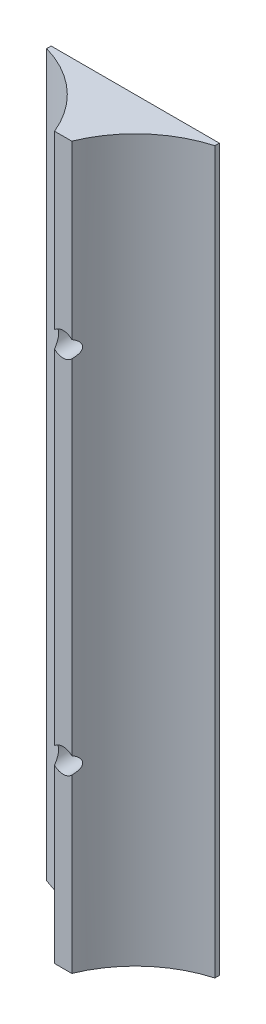
ISO-10303-21;
HEADER;
FILE_DESCRIPTION(('STEP AP214'),'2;1');
FILE_NAME('part.step','',(''),(''),'','','');
FILE_SCHEMA(('AUTOMOTIVE_DESIGN { 1 0 10303 214 1 1 1 1 }'));
ENDSEC;
DATA;
#1=APPLICATION_CONTEXT('core data for automotive mechanical design processes');
#2=APPLICATION_PROTOCOL_DEFINITION('international standard','automotive_design',2000,#1);
#3=PRODUCT_CONTEXT('',#1,'mechanical');
#4=PRODUCT('Part','Part','',(#3));
#5=PRODUCT_RELATED_PRODUCT_CATEGORY('part','',(#4));
#6=PRODUCT_DEFINITION_FORMATION('','',#4);
#7=PRODUCT_DEFINITION_CONTEXT('part definition',#1,'design');
#8=PRODUCT_DEFINITION('design','',#6,#7);
#9=PRODUCT_DEFINITION_SHAPE('','',#8);
#10=(LENGTH_UNIT() NAMED_UNIT(*) SI_UNIT(.MILLI.,.METRE.));
#11=(NAMED_UNIT(*) PLANE_ANGLE_UNIT() SI_UNIT($,.RADIAN.));
#12=(NAMED_UNIT(*) SI_UNIT($,.STERADIAN.) SOLID_ANGLE_UNIT());
#13=UNCERTAINTY_MEASURE_WITH_UNIT(LENGTH_MEASURE(1.E-05),#10,'distance_accuracy_value','');
#14=(GEOMETRIC_REPRESENTATION_CONTEXT(3) GLOBAL_UNCERTAINTY_ASSIGNED_CONTEXT((#13)) GLOBAL_UNIT_ASSIGNED_CONTEXT((#10,
#11,#12)) REPRESENTATION_CONTEXT('',''));
#15=CARTESIAN_POINT('',(0.,0.,0.));
#16=DIRECTION('',(0.,0.,1.));
#17=DIRECTION('',(1.,0.,0.));
#18=AXIS2_PLACEMENT_3D('',#15,#16,#17);
#19=CARTESIAN_POINT('',(-0.716915426349083,60.,0.));
#20=DIRECTION('',(0.,0.,-1.));
#21=DIRECTION('',(-1.,0.,0.));
#22=AXIS2_PLACEMENT_3D('',#19,#20,#21);
#23=PLANE('',#22);
#24=DIRECTION('',(0.,-1.,0.));
#25=VECTOR('',#24,1.);
#26=CARTESIAN_POINT('',(-0.716915426349083,60.,0.));
#27=LINE('',#26,#25);
#28=CARTESIAN_POINT('',(-0.716915426349083,60.,0.));
#29=VERTEX_POINT('',#28);
#30=CARTESIAN_POINT('',(-0.716915426349083,45.6971601476438,0.));
#31=VERTEX_POINT('',#30);
#32=EDGE_CURVE('E141',#29,#31,#27,.T.);
#33=ORIENTED_EDGE('',*,*,#32,.T.);
#34=CARTESIAN_POINT('',(0.,45.,0.));
#35=DIRECTION('',(0.,0.,-1.));
#36=DIRECTION('',(-1.,0.,0.));
#37=AXIS2_PLACEMENT_3D('',#34,#35,#36);
#38=CIRCLE('',#37,0.999999999999999);
#39=CARTESIAN_POINT('',(0.71691542634908,45.6971601476438,0.));
#40=VERTEX_POINT('',#39);
#41=EDGE_CURVE('E66',#31,#40,#38,.T.);
#42=ORIENTED_EDGE('',*,*,#41,.T.);
#43=DIRECTION('',(0.,-1.,0.));
#44=VECTOR('',#43,1.);
#45=CARTESIAN_POINT('',(0.71691542634908,60.,0.));
#46=LINE('',#45,#44);
#47=CARTESIAN_POINT('',(0.71691542634908,60.,0.));
#48=VERTEX_POINT('',#47);
#49=EDGE_CURVE('E146',#48,#40,#46,.T.);
#50=ORIENTED_EDGE('',*,*,#49,.F.);
#51=DIRECTION('',(1.,0.,0.));
#52=VECTOR('',#51,1.);
#53=CARTESIAN_POINT('',(-0.716915426349083,60.,0.));
#54=LINE('',#53,#52);
#55=EDGE_CURVE('E226',#29,#48,#54,.T.);
#56=ORIENTED_EDGE('',*,*,#55,.F.);
#57=EDGE_LOOP('',(#33,#42,#50,#56));
#58=FACE_BOUND('',#57,.T.);
#59=ADVANCED_FACE('F44',(#58),#23,.F.);
#60=CARTESIAN_POINT('',(0.71691542634908,44.3028398523562,0.));
#61=VERTEX_POINT('',#60);
#62=CARTESIAN_POINT('',(0.71691542634908,15.6971601476438,0.));
#63=VERTEX_POINT('',#62);
#64=EDGE_CURVE('E135',#61,#63,#46,.T.);
#65=ORIENTED_EDGE('',*,*,#64,.F.);
#66=CARTESIAN_POINT('',(-0.716915426349081,44.3028398523562,0.));
#67=VERTEX_POINT('',#66);
#68=EDGE_CURVE('E128',#61,#67,#38,.T.);
#69=ORIENTED_EDGE('',*,*,#68,.T.);
#70=CARTESIAN_POINT('',(-0.716915426349083,15.6971601476438,0.));
#71=VERTEX_POINT('',#70);
#72=EDGE_CURVE('E73',#67,#71,#27,.T.);
#73=ORIENTED_EDGE('',*,*,#72,.T.);
#74=CARTESIAN_POINT('',(0.,15.,0.));
#75=DIRECTION('',(0.,0.,-1.));
#76=DIRECTION('',(-1.,0.,0.));
#77=AXIS2_PLACEMENT_3D('',#74,#75,#76);
#78=CIRCLE('',#77,0.999999999999999);
#79=EDGE_CURVE('E176',#71,#63,#78,.T.);
#80=ORIENTED_EDGE('',*,*,#79,.T.);
#81=EDGE_LOOP('',(#65,#69,#73,#80));
#82=FACE_BOUND('',#81,.T.);
#83=ADVANCED_FACE('F134',(#82),#23,.F.);
#84=CARTESIAN_POINT('',(-9.65,60.,3.65));
#85=DIRECTION('',(0.,-1.,0.));
#86=DIRECTION('',(0.,0.,-1.));
#87=AXIS2_PLACEMENT_3D('',#84,#85,#86);
#88=CYLINDRICAL_SURFACE('',#87,9.65);
#89=ORIENTED_EDGE('',*,*,#72,.F.);
#90=CARTESIAN_POINT('',(-0.716915426349081,44.3028398523562,0.));
#91=CARTESIAN_POINT('',(-0.731626591559953,44.317993066255,-0.0360125500297371));
#92=CARTESIAN_POINT('',(-0.746427289121782,44.3341497378012,-0.071606126745061));
#93=CARTESIAN_POINT('',(-0.776091596441795,44.3689553691987,-0.141792911078142));
#94=CARTESIAN_POINT('',(-0.790955115741165,44.3876172826375,-0.176379698883334));
#95=CARTESIAN_POINT('',(-0.820713268380293,44.4281001795659,-0.244560990086599));
#96=CARTESIAN_POINT('',(-0.835604256269462,44.4499688224498,-0.278129185257088));
#97=CARTESIAN_POINT('',(-0.864791011542178,44.4971038626147,-0.342976375015039));
#98=CARTESIAN_POINT('',(-0.879088127702686,44.5223619390459,-0.374260694794433));
#99=CARTESIAN_POINT('',(-0.90373060494839,44.5712174063406,-0.427492562947483));
#100=CARTESIAN_POINT('',(-0.914278910308853,44.5940653716595,-0.450027808037208));
#101=CARTESIAN_POINT('',(-0.934289550986945,44.6425247464023,-0.492395212917311));
#102=CARTESIAN_POINT('',(-0.943754081543092,44.6681303582159,-0.51223285270145));
#103=CARTESIAN_POINT('',(-0.961202858489315,44.722657704727,-0.548537268026509));
#104=CARTESIAN_POINT('',(-0.969166528173057,44.7516178115844,-0.564957469776029));
#105=CARTESIAN_POINT('',(-0.982730330026047,44.8123790990689,-0.592779662883932));
#106=CARTESIAN_POINT('',(-0.988335631475443,44.8441738789142,-0.604192631912942));
#107=CARTESIAN_POINT('',(-0.995439162156062,44.9014519366418,-0.618620867500795));
#108=CARTESIAN_POINT('',(-0.997617314998399,44.9264997580079,-0.62302944421574));
#109=CARTESIAN_POINT('',(-1.00005656533799,44.9770685583627,-0.627965285179228));
#110=CARTESIAN_POINT('',(-1.00031864577151,45.002589288014,-0.628494539502527));
#111=CARTESIAN_POINT('',(-0.998899314656266,45.0533351820465,-0.625623814816787));
#112=CARTESIAN_POINT('',(-0.997218870568463,45.0785604872436,-0.62222579176134));
#113=CARTESIAN_POINT('',(-0.99207978464136,45.1280571859245,-0.611801332437795));
#114=CARTESIAN_POINT('',(-0.988619911431289,45.1523279062961,-0.604772383542305));
#115=CARTESIAN_POINT('',(-0.978845684035985,45.2070301995629,-0.584824756764977));
#116=CARTESIAN_POINT('',(-0.971971206592135,45.236933391623,-0.570738998278085));
#117=CARTESIAN_POINT('',(-0.956316603020585,45.2938265752719,-0.53839981571781));
#118=CARTESIAN_POINT('',(-0.947532962027114,45.3208110542777,-0.520138701339642));
#119=CARTESIAN_POINT('',(-0.923337388047236,45.3863558037991,-0.469347644673791));
#120=CARTESIAN_POINT('',(-0.906987313931184,45.4228257363458,-0.434590792193247));
#121=CARTESIAN_POINT('',(-0.872660120566985,45.4897831897159,-0.360299334114968));
#122=CARTESIAN_POINT('',(-0.854675165013883,45.5202394098099,-0.320741376128269));
#123=CARTESIAN_POINT('',(-0.816654175974628,45.5782433109871,-0.235465213914605));
#124=CARTESIAN_POINT('',(-0.796565677787949,45.605399230859,-0.18950743874143));
#125=CARTESIAN_POINT('',(-0.766499034599836,45.6424370315779,-0.119158167411911));
#126=CARTESIAN_POINT('',(-0.756560208295124,45.6540949082111,-0.0956497242915917));
#127=CARTESIAN_POINT('',(-0.736709217165992,45.67637359029,-0.0481628907346409));
#128=CARTESIAN_POINT('',(-0.72679703667349,45.6869952886531,-0.0241849266891303));
#129=CARTESIAN_POINT('',(-0.716915426349082,45.6971601476438,0.));
#130=B_SPLINE_CURVE_WITH_KNOTS('',3,(#90,#91,#92,#93,#94,#95,#96,#97,#98,#99,#100,#101,#102,
#103,#104,#105,#106,#107,#108,#109,#110,#111,#112,#113,#114,#115,#116,#117,#118,#119,#120,#121,
#122,#123,#124,#125,#126,#127,#128,#129),.UNSPECIFIED.,.F.,.F.,(4,2,2,2,2,2,2,2,2,2,2,2,2,2,2,2,
2,2,2,4),(0.,0.125283365511654,0.251241443009631,0.379308364144583,0.507066452204209,
0.608220800752168,0.70916648965566,0.811408876611758,0.913425977204674,0.989662890338827,
1.06586069154408,1.14202055930405,1.21823320099602,1.31895158469356,1.41985699077545,
1.57786206854548,1.73666903909468,1.90743541851957,1.99159762809235,2.07568665881576),.UNSPECIFIED.);
#131=EDGE_CURVE('E11',#67,#31,#130,.T.);
#132=ORIENTED_EDGE('',*,*,#131,.T.);
#133=ORIENTED_EDGE('',*,*,#32,.F.);
#134=CARTESIAN_POINT('',(-9.65,60.,3.65));
#135=DIRECTION('',(0.,-1.,0.));
#136=DIRECTION('',(0.,0.,-1.));
#137=AXIS2_PLACEMENT_3D('',#134,#135,#136);
#138=CIRCLE('',#137,9.65);
#139=CARTESIAN_POINT('',(-7.,60.,-5.62900856772964));
#140=VERTEX_POINT('',#139);
#141=EDGE_CURVE('E231',#140,#29,#138,.T.);
#142=ORIENTED_EDGE('',*,*,#141,.F.);
#143=DIRECTION('',(0.,-1.,0.));
#144=VECTOR('',#143,1.);
#145=CARTESIAN_POINT('',(-7.,60.,-5.62900856772964));
#146=LINE('',#145,#144);
#147=CARTESIAN_POINT('',(-7.,0.,-5.62900856772964));
#148=VERTEX_POINT('',#147);
#149=EDGE_CURVE('E234',#140,#148,#146,.T.);
#150=ORIENTED_EDGE('',*,*,#149,.T.);
#151=CARTESIAN_POINT('',(-9.65,0.,3.65));
#152=DIRECTION('',(0.,-1.,0.));
#153=DIRECTION('',(0.,0.,-1.));
#154=AXIS2_PLACEMENT_3D('',#151,#152,#153);
#155=CIRCLE('',#154,9.65);
#156=CARTESIAN_POINT('',(-0.716915426349083,0.,0.));
#157=VERTEX_POINT('',#156);
#158=EDGE_CURVE('E260',#148,#157,#155,.T.);
#159=ORIENTED_EDGE('',*,*,#158,.T.);
#160=CARTESIAN_POINT('',(-0.716915426349081,14.3028398523562,0.));
#161=VERTEX_POINT('',#160);
#162=EDGE_CURVE('E142',#161,#157,#27,.T.);
#163=ORIENTED_EDGE('',*,*,#162,.F.);
#164=CARTESIAN_POINT('',(-0.716915426349081,14.3028398523562,0.));
#165=CARTESIAN_POINT('',(-0.731626591559953,14.317993066255,-0.0360125500297339));
#166=CARTESIAN_POINT('',(-0.746427289121782,14.3341497378012,-0.0716061267450571));
#167=CARTESIAN_POINT('',(-0.776091596441795,14.3689553691987,-0.14179291107814));
#168=CARTESIAN_POINT('',(-0.790955115741165,14.3876172826375,-0.176379698883334));
#169=CARTESIAN_POINT('',(-0.820713268380293,14.4281001795659,-0.244560990086598));
#170=CARTESIAN_POINT('',(-0.835604256269462,14.4499688224498,-0.278129185257086));
#171=CARTESIAN_POINT('',(-0.864791011542177,14.4971038626148,-0.342976375015037));
#172=CARTESIAN_POINT('',(-0.879088127702684,14.5223619390459,-0.374260694794434));
#173=CARTESIAN_POINT('',(-0.903730604948388,14.5712174063406,-0.427492562947484));
#174=CARTESIAN_POINT('',(-0.914278910308852,14.5940653716595,-0.450027808037209));
#175=CARTESIAN_POINT('',(-0.934289550986945,14.6425247464023,-0.49239521291731));
#176=CARTESIAN_POINT('',(-0.943754081543092,14.668130358216,-0.512232852701449));
#177=CARTESIAN_POINT('',(-0.961202858489316,14.722657704727,-0.54853726802651));
#178=CARTESIAN_POINT('',(-0.969166528173057,14.7516178115844,-0.564957469776031));
#179=CARTESIAN_POINT('',(-0.982730330026048,14.8123790990689,-0.592779662883937));
#180=CARTESIAN_POINT('',(-0.988335631475444,14.8441738789142,-0.604192631912949));
#181=CARTESIAN_POINT('',(-0.995439162156063,14.9014519366418,-0.618620867500799));
#182=CARTESIAN_POINT('',(-0.997617314998399,14.9264997580079,-0.62302944421574));
#183=CARTESIAN_POINT('',(-1.00005656533799,14.9770685583627,-0.627965285179226));
#184=CARTESIAN_POINT('',(-1.00031864577151,15.002589288014,-0.628494539502527));
#185=CARTESIAN_POINT('',(-0.998899314656266,15.0533351820465,-0.625623814816786));
#186=CARTESIAN_POINT('',(-0.997218870568463,15.0785604872436,-0.622225791761335));
#187=CARTESIAN_POINT('',(-0.992079784641359,15.1280571859245,-0.611801332437789));
#188=CARTESIAN_POINT('',(-0.988619911431288,15.1523279062961,-0.604772383542302));
#189=CARTESIAN_POINT('',(-0.978845684035985,15.2070301995629,-0.584824756764976));
#190=CARTESIAN_POINT('',(-0.971971206592135,15.236933391623,-0.570738998278082));
#191=CARTESIAN_POINT('',(-0.956316603020585,15.2938265752719,-0.538399815717806));
#192=CARTESIAN_POINT('',(-0.947532962027114,15.3208110542777,-0.520138701339639));
#193=CARTESIAN_POINT('',(-0.923337388047234,15.3863558037991,-0.469347644673789));
#194=CARTESIAN_POINT('',(-0.906987313931182,15.4228257363458,-0.434590792193243));
#195=CARTESIAN_POINT('',(-0.872660120566983,15.4897831897159,-0.360299334114964));
#196=CARTESIAN_POINT('',(-0.854675165013881,15.5202394098099,-0.320741376128264));
#197=CARTESIAN_POINT('',(-0.816654175974626,15.5782433109871,-0.2354652139146));
#198=CARTESIAN_POINT('',(-0.796565677787948,15.605399230859,-0.189507438741425));
#199=CARTESIAN_POINT('',(-0.766499034599834,15.6424370315779,-0.119158167411908));
#200=CARTESIAN_POINT('',(-0.756560208295121,15.6540949082111,-0.0956497242915889));
#201=CARTESIAN_POINT('',(-0.736709217165989,15.67637359029,-0.0481628907346395));
#202=CARTESIAN_POINT('',(-0.726797036673487,15.6869952886531,-0.0241849266891301));
#203=CARTESIAN_POINT('',(-0.716915426349082,15.6971601476438,0.));
#204=B_SPLINE_CURVE_WITH_KNOTS('',3,(#164,#165,#166,#167,#168,#169,#170,#171,#172,#173,#174,
#175,#176,#177,#178,#179,#180,#181,#182,#183,#184,#185,#186,#187,#188,#189,#190,#191,#192,#193,
#194,#195,#196,#197,#198,#199,#200,#201,#202,#203),.UNSPECIFIED.,.F.,.F.,(4,2,2,2,2,2,2,2,2,2,2,
2,2,2,2,2,2,2,2,4),(0.,0.125283365511651,0.251241443009631,0.379308364144585,0.507066452204207,
0.608220800752166,0.709166489655664,0.811408876611768,0.913425977204679,0.989662890338838,
1.06586069154409,1.14202055930407,1.21823320099603,1.31895158469356,1.41985699077545,
1.57786206854549,1.73666903909469,1.90743541851957,1.99159762809236,2.07568665881576),.UNSPECIFIED.);
#205=EDGE_CURVE('E59',#161,#71,#204,.T.);
#206=ORIENTED_EDGE('',*,*,#205,.T.);
#207=EDGE_LOOP('',(#89,#132,#133,#142,#150,#159,#163,#206));
#208=FACE_BOUND('',#207,.T.);
#209=ADVANCED_FACE('F46',(#208),#88,.F.);
#210=CARTESIAN_POINT('',(0.71691542634908,14.3028398523562,0.));
#211=VERTEX_POINT('',#210);
#212=CARTESIAN_POINT('',(0.71691542634908,0.,0.));
#213=VERTEX_POINT('',#212);
#214=EDGE_CURVE('E209',#211,#213,#46,.T.);
#215=ORIENTED_EDGE('',*,*,#214,.F.);
#216=EDGE_CURVE('E177',#211,#161,#78,.T.);
#217=ORIENTED_EDGE('',*,*,#216,.T.);
#218=ORIENTED_EDGE('',*,*,#162,.T.);
#219=DIRECTION('',(1.,0.,0.));
#220=VECTOR('',#219,1.);
#221=CARTESIAN_POINT('',(-0.716915426349083,0.,0.));
#222=LINE('',#221,#220);
#223=EDGE_CURVE('E212',#157,#213,#222,.T.);
#224=ORIENTED_EDGE('',*,*,#223,.T.);
#225=EDGE_LOOP('',(#215,#217,#218,#224));
#226=FACE_BOUND('',#225,.T.);
#227=ADVANCED_FACE('F185',(#226),#23,.F.);
#228=CARTESIAN_POINT('',(9.65,60.,3.65));
#229=DIRECTION('',(0.,-1.,0.));
#230=DIRECTION('',(0.,0.,-1.));
#231=AXIS2_PLACEMENT_3D('',#228,#229,#230);
#232=CYLINDRICAL_SURFACE('',#231,9.65);
#233=ORIENTED_EDGE('',*,*,#49,.T.);
#234=CARTESIAN_POINT('',(0.71691542634908,45.6971601476438,0.));
#235=CARTESIAN_POINT('',(0.731626591559951,45.682006933745,-0.0360125500297358));
#236=CARTESIAN_POINT('',(0.746427289121779,45.6658502621988,-0.0716061267450583));
#237=CARTESIAN_POINT('',(0.776091596441791,45.6310446308013,-0.141792911078141));
#238=CARTESIAN_POINT('',(0.790955115741161,45.6123827173625,-0.176379698883335));
#239=CARTESIAN_POINT('',(0.820713268380289,45.5718998204341,-0.2445609900866));
#240=CARTESIAN_POINT('',(0.835604256269459,45.5500311775502,-0.278129185257087));
#241=CARTESIAN_POINT('',(0.864791011542176,45.5028961373852,-0.342976375015039));
#242=CARTESIAN_POINT('',(0.879088127702683,45.4776380609541,-0.374260694794436));
#243=CARTESIAN_POINT('',(0.903730604948387,45.4287825936594,-0.42749256294749));
#244=CARTESIAN_POINT('',(0.914278910308851,45.4059346283405,-0.450027808037217));
#245=CARTESIAN_POINT('',(0.934289550986944,45.3574752535977,-0.49239521291732));
#246=CARTESIAN_POINT('',(0.943754081543091,45.331869641784,-0.512232852701457));
#247=CARTESIAN_POINT('',(0.961202858489315,45.277342295273,-0.548537268026518));
#248=CARTESIAN_POINT('',(0.969166528173058,45.2483821884156,-0.56495746977604));
#249=CARTESIAN_POINT('',(0.982730330026048,45.1876209009311,-0.592779662883942));
#250=CARTESIAN_POINT('',(0.988335631475443,45.1558261210858,-0.604192631912951));
#251=CARTESIAN_POINT('',(0.995439162156062,45.0985480633582,-0.6186208675008));
#252=CARTESIAN_POINT('',(0.997617314998399,45.0735002419921,-0.623029444215743));
#253=CARTESIAN_POINT('',(1.00005656533799,45.0229314416373,-0.627965285179234));
#254=CARTESIAN_POINT('',(1.00031864577151,44.997410711986,-0.628494539502538));
#255=CARTESIAN_POINT('',(0.998899314656266,44.9466648179535,-0.625623814816797));
#256=CARTESIAN_POINT('',(0.997218870568463,44.9214395127564,-0.622225791761342));
#257=CARTESIAN_POINT('',(0.992079784641359,44.8719428140755,-0.611801332437794));
#258=CARTESIAN_POINT('',(0.988619911431287,44.8476720937039,-0.60477238354231));
#259=CARTESIAN_POINT('',(0.978845684035984,44.7929698004371,-0.584824756764986));
#260=CARTESIAN_POINT('',(0.971971206592134,44.763066608377,-0.570738998278089));
#261=CARTESIAN_POINT('',(0.956316603020585,44.7061734247281,-0.538399815717811));
#262=CARTESIAN_POINT('',(0.947532962027114,44.6791889457223,-0.520138701339646));
#263=CARTESIAN_POINT('',(0.923337388047236,44.6136441962009,-0.469347644673799));
#264=CARTESIAN_POINT('',(0.906987313931183,44.5771742636542,-0.434590792193255));
#265=CARTESIAN_POINT('',(0.872660120566985,44.5102168102841,-0.360299334114978));
#266=CARTESIAN_POINT('',(0.854675165013884,44.4797605901901,-0.320741376128279));
#267=CARTESIAN_POINT('',(0.816654175974629,44.4217566890129,-0.235465213914613));
#268=CARTESIAN_POINT('',(0.79656567778795,44.394600769141,-0.189507438741436));
#269=CARTESIAN_POINT('',(0.766499034599835,44.3575629684221,-0.119158167411913));
#270=CARTESIAN_POINT('',(0.756560208295122,44.3459050917889,-0.0956497242915926));
#271=CARTESIAN_POINT('',(0.736709217165989,44.32362640971,-0.0481628907346419));
#272=CARTESIAN_POINT('',(0.726797036673487,44.3130047113469,-0.0241849266891331));
#273=CARTESIAN_POINT('',(0.716915426349079,44.3028398523562,0.));
#274=B_SPLINE_CURVE_WITH_KNOTS('',3,(#234,#235,#236,#237,#238,#239,#240,#241,#242,#243,#244,
#245,#246,#247,#248,#249,#250,#251,#252,#253,#254,#255,#256,#257,#258,#259,#260,#261,#262,#263,
#264,#265,#266,#267,#268,#269,#270,#271,#272,#273),.UNSPECIFIED.,.F.,.F.,(4,2,2,2,2,2,2,2,2,2,2,
2,2,2,2,2,2,2,2,4),(0.,0.125283365511647,0.251241443009628,0.379308364144585,0.507066452204209,
0.608220800752171,0.709166489655667,0.811408876611781,0.913425977204681,0.989662890338834,
1.06586069154409,1.14202055930408,1.21823320099603,1.31895158469358,1.41985699077546,
1.57786206854548,1.73666903909469,1.90743541851958,1.99159762809237,2.07568665881577),.UNSPECIFIED.);
#275=EDGE_CURVE('E190',#40,#61,#274,.T.);
#276=ORIENTED_EDGE('',*,*,#275,.T.);
#277=ORIENTED_EDGE('',*,*,#64,.T.);
#278=CARTESIAN_POINT('',(0.71691542634908,15.6971601476438,0.));
#279=CARTESIAN_POINT('',(0.731626591559952,15.682006933745,-0.0360125500297375));
#280=CARTESIAN_POINT('',(0.746427289121781,15.6658502621988,-0.0716061267450605));
#281=CARTESIAN_POINT('',(0.776091596441794,15.6310446308013,-0.141792911078142));
#282=CARTESIAN_POINT('',(0.790955115741164,15.6123827173625,-0.176379698883335));
#283=CARTESIAN_POINT('',(0.820713268380291,15.5718998204341,-0.244560990086601));
#284=CARTESIAN_POINT('',(0.835604256269461,15.5500311775502,-0.278129185257089));
#285=CARTESIAN_POINT('',(0.864791011542177,15.5028961373853,-0.34297637501504));
#286=CARTESIAN_POINT('',(0.879088127702685,15.4776380609541,-0.374260694794435));
#287=CARTESIAN_POINT('',(0.903730604948388,15.4287825936594,-0.427492562947488));
#288=CARTESIAN_POINT('',(0.914278910308851,15.4059346283405,-0.450027808037215));
#289=CARTESIAN_POINT('',(0.934289550986944,15.3574752535977,-0.492395212917318));
#290=CARTESIAN_POINT('',(0.943754081543092,15.331869641784,-0.512232852701455));
#291=CARTESIAN_POINT('',(0.961202858489316,15.277342295273,-0.548537268026515));
#292=CARTESIAN_POINT('',(0.969166528173057,15.2483821884156,-0.564957469776037));
#293=CARTESIAN_POINT('',(0.982730330026048,15.1876209009311,-0.592779662883944));
#294=CARTESIAN_POINT('',(0.988335631475444,15.1558261210858,-0.604192631912957));
#295=CARTESIAN_POINT('',(0.995439162156063,15.0985480633582,-0.618620867500805));
#296=CARTESIAN_POINT('',(0.997617314998399,15.0735002419921,-0.623029444215744));
#297=CARTESIAN_POINT('',(1.00005656533799,15.0229314416373,-0.627965285179232));
#298=CARTESIAN_POINT('',(1.00031864577151,14.997410711986,-0.628494539502537));
#299=CARTESIAN_POINT('',(0.998899314656266,14.9466648179535,-0.625623814816798));
#300=CARTESIAN_POINT('',(0.997218870568462,14.9214395127564,-0.622225791761344));
#301=CARTESIAN_POINT('',(0.992079784641358,14.8719428140755,-0.611801332437794));
#302=CARTESIAN_POINT('',(0.988619911431287,14.8476720937039,-0.604772383542306));
#303=CARTESIAN_POINT('',(0.978845684035983,14.7929698004371,-0.58482475676498));
#304=CARTESIAN_POINT('',(0.971971206592132,14.763066608377,-0.570738998278087));
#305=CARTESIAN_POINT('',(0.956316603020581,14.7061734247281,-0.53839981571781));
#306=CARTESIAN_POINT('',(0.94753296202711,14.6791889457223,-0.520138701339642));
#307=CARTESIAN_POINT('',(0.92333738804723,14.6136441962009,-0.46934764467379));
#308=CARTESIAN_POINT('',(0.906987313931177,14.5771742636541,-0.434590792193244));
#309=CARTESIAN_POINT('',(0.872660120566978,14.5102168102841,-0.360299334114962));
#310=CARTESIAN_POINT('',(0.854675165013875,14.4797605901901,-0.320741376128259));
#311=CARTESIAN_POINT('',(0.816654175974621,14.4217566890128,-0.235465213914593));
#312=CARTESIAN_POINT('',(0.796565677787944,14.394600769141,-0.189507438741419));
#313=CARTESIAN_POINT('',(0.766499034599831,14.3575629684221,-0.119158167411904));
#314=CARTESIAN_POINT('',(0.756560208295118,14.3459050917889,-0.0956497242915866));
#315=CARTESIAN_POINT('',(0.736709217165987,14.3236264097099,-0.04816289073464));
#316=CARTESIAN_POINT('',(0.726797036673486,14.3130047113469,-0.0241849266891321));
#317=CARTESIAN_POINT('',(0.71691542634908,14.3028398523562,0.));
#318=B_SPLINE_CURVE_WITH_KNOTS('',3,(#278,#279,#280,#281,#282,#283,#284,#285,#286,#287,#288,
#289,#290,#291,#292,#293,#294,#295,#296,#297,#298,#299,#300,#301,#302,#303,#304,#305,#306,#307,
#308,#309,#310,#311,#312,#313,#314,#315,#316,#317),.UNSPECIFIED.,.F.,.F.,(4,2,2,2,2,2,2,2,2,2,2,
2,2,2,2,2,2,2,2,4),(0.,0.12528336551165,0.251241443009629,0.379308364144584,0.507066452204208,
0.608220800752169,0.709166489655667,0.811408876611771,0.913425977204682,0.989662890338843,
1.06586069154409,1.14202055930407,1.21823320099604,1.31895158469358,1.41985699077547,
1.5778620685455,1.73666903909471,1.90743541851959,1.99159762809238,2.07568665881577),.UNSPECIFIED.);
#319=EDGE_CURVE('E165',#63,#211,#318,.T.);
#320=ORIENTED_EDGE('',*,*,#319,.T.);
#321=ORIENTED_EDGE('',*,*,#214,.T.);
#322=CARTESIAN_POINT('',(9.65,0.,3.65));
#323=DIRECTION('',(0.,-1.,0.));
#324=DIRECTION('',(0.,0.,-1.));
#325=AXIS2_PLACEMENT_3D('',#322,#323,#324);
#326=CIRCLE('',#325,9.65);
#327=CARTESIAN_POINT('',(7.,0.,-5.62900856772964));
#328=VERTEX_POINT('',#327);
#329=EDGE_CURVE('E265',#213,#328,#326,.T.);
#330=ORIENTED_EDGE('',*,*,#329,.T.);
#331=DIRECTION('',(0.,-1.,0.));
#332=VECTOR('',#331,1.);
#333=CARTESIAN_POINT('',(7.,60.,-5.62900856772964));
#334=LINE('',#333,#332);
#335=CARTESIAN_POINT('',(7.,60.,-5.62900856772964));
#336=VERTEX_POINT('',#335);
#337=EDGE_CURVE('E215',#336,#328,#334,.T.);
#338=ORIENTED_EDGE('',*,*,#337,.F.);
#339=CARTESIAN_POINT('',(9.65,60.,3.65));
#340=DIRECTION('',(0.,-1.,0.));
#341=DIRECTION('',(0.,0.,-1.));
#342=AXIS2_PLACEMENT_3D('',#339,#340,#341);
#343=CIRCLE('',#342,9.65);
#344=EDGE_CURVE('E224',#48,#336,#343,.T.);
#345=ORIENTED_EDGE('',*,*,#344,.F.);
#346=EDGE_LOOP('',(#233,#276,#277,#320,#321,#330,#338,#345));
#347=FACE_BOUND('',#346,.T.);
#348=ADVANCED_FACE('F180',(#347),#232,.F.);
#349=CARTESIAN_POINT('',(7.,60.,-5.62900856772964));
#350=DIRECTION('',(-1.,0.,0.));
#351=DIRECTION('',(0.,0.,1.));
#352=AXIS2_PLACEMENT_3D('',#349,#350,#351);
#353=PLANE('',#352);
#354=DIRECTION('',(0.,0.,-1.));
#355=VECTOR('',#354,1.);
#356=CARTESIAN_POINT('',(7.,0.,-5.62900856772964));
#357=LINE('',#356,#355);
#358=CARTESIAN_POINT('',(7.,0.,-6.));
#359=VERTEX_POINT('',#358);
#360=EDGE_CURVE('E268',#328,#359,#357,.T.);
#361=ORIENTED_EDGE('',*,*,#360,.T.);
#362=DIRECTION('',(0.,-1.,0.));
#363=VECTOR('',#362,1.);
#364=CARTESIAN_POINT('',(7.,60.,-6.));
#365=LINE('',#364,#363);
#366=CARTESIAN_POINT('',(7.,60.,-6.));
#367=VERTEX_POINT('',#366);
#368=EDGE_CURVE('E219',#367,#359,#365,.T.);
#369=ORIENTED_EDGE('',*,*,#368,.F.);
#370=DIRECTION('',(0.,0.,-1.));
#371=VECTOR('',#370,1.);
#372=CARTESIAN_POINT('',(7.,60.,-5.62900856772964));
#373=LINE('',#372,#371);
#374=EDGE_CURVE('E251',#336,#367,#373,.T.);
#375=ORIENTED_EDGE('',*,*,#374,.F.);
#376=ORIENTED_EDGE('',*,*,#337,.T.);
#377=EDGE_LOOP('',(#361,#369,#375,#376));
#378=FACE_BOUND('',#377,.T.);
#379=ADVANCED_FACE('F184',(#378),#353,.F.);
#380=CARTESIAN_POINT('',(7.,60.,-6.));
#381=DIRECTION('',(0.,0.,1.));
#382=DIRECTION('',(1.,0.,0.));
#383=AXIS2_PLACEMENT_3D('',#380,#381,#382);
#384=PLANE('',#383);
#385=CARTESIAN_POINT('',(0.,45.,-6.));
#386=DIRECTION('',(0.,0.,-1.));
#387=DIRECTION('',(-1.,0.,0.));
#388=AXIS2_PLACEMENT_3D('',#385,#386,#387);
#389=CIRCLE('',#388,1.27499999999999);
#390=CARTESIAN_POINT('',(-1.27499999999999,45.,-6.));
#391=VERTEX_POINT('',#390);
#392=EDGE_CURVE('E441',#391,#391,#389,.T.);
#393=ORIENTED_EDGE('',*,*,#392,.F.);
#394=EDGE_LOOP('',(#393));
#395=FACE_BOUND('',#394,.T.);
#396=CARTESIAN_POINT('',(0.,15.,-6.));
#397=DIRECTION('',(0.,0.,-1.));
#398=DIRECTION('',(-1.,0.,0.));
#399=AXIS2_PLACEMENT_3D('',#396,#397,#398);
#400=CIRCLE('',#399,1.27499999999999);
#401=CARTESIAN_POINT('',(-1.27499999999999,15.,-6.));
#402=VERTEX_POINT('',#401);
#403=EDGE_CURVE('E433',#402,#402,#400,.T.);
#404=ORIENTED_EDGE('',*,*,#403,.F.);
#405=EDGE_LOOP('',(#404));
#406=FACE_BOUND('',#405,.T.);
#407=DIRECTION('',(-1.,0.,0.));
#408=VECTOR('',#407,1.);
#409=CARTESIAN_POINT('',(7.,0.,-6.));
#410=LINE('',#409,#408);
#411=CARTESIAN_POINT('',(-7.,0.,-6.));
#412=VERTEX_POINT('',#411);
#413=EDGE_CURVE('E243',#359,#412,#410,.T.);
#414=ORIENTED_EDGE('',*,*,#413,.T.);
#415=DIRECTION('',(0.,-1.,0.));
#416=VECTOR('',#415,1.);
#417=CARTESIAN_POINT('',(-7.,60.,-6.));
#418=LINE('',#417,#416);
#419=CARTESIAN_POINT('',(-7.,60.,-6.));
#420=VERTEX_POINT('',#419);
#421=EDGE_CURVE('E275',#420,#412,#418,.T.);
#422=ORIENTED_EDGE('',*,*,#421,.F.);
#423=DIRECTION('',(-1.,0.,0.));
#424=VECTOR('',#423,1.);
#425=CARTESIAN_POINT('',(7.,60.,-6.));
#426=LINE('',#425,#424);
#427=EDGE_CURVE('E254',#367,#420,#426,.T.);
#428=ORIENTED_EDGE('',*,*,#427,.F.);
#429=ORIENTED_EDGE('',*,*,#368,.T.);
#430=EDGE_LOOP('',(#414,#422,#428,#429));
#431=FACE_BOUND('',#430,.T.);
#432=ADVANCED_FACE('F285',(#395,#406,#431),#384,.F.);
#433=CARTESIAN_POINT('',(-7.,60.,-6.));
#434=DIRECTION('',(1.,0.,0.));
#435=DIRECTION('',(0.,0.,-1.));
#436=AXIS2_PLACEMENT_3D('',#433,#434,#435);
#437=PLANE('',#436);
#438=DIRECTION('',(0.,0.,1.));
#439=VECTOR('',#438,1.);
#440=CARTESIAN_POINT('',(-7.,0.,-6.));
#441=LINE('',#440,#439);
#442=EDGE_CURVE('E238',#412,#148,#441,.T.);
#443=ORIENTED_EDGE('',*,*,#442,.T.);
#444=ORIENTED_EDGE('',*,*,#149,.F.);
#445=DIRECTION('',(0.,0.,1.));
#446=VECTOR('',#445,1.);
#447=CARTESIAN_POINT('',(-7.,60.,-6.));
#448=LINE('',#447,#446);
#449=EDGE_CURVE('E257',#420,#140,#448,.T.);
#450=ORIENTED_EDGE('',*,*,#449,.F.);
#451=ORIENTED_EDGE('',*,*,#421,.T.);
#452=EDGE_LOOP('',(#443,#444,#450,#451));
#453=FACE_BOUND('',#452,.T.);
#454=ADVANCED_FACE('F294',(#453),#437,.F.);
#455=CARTESIAN_POINT('',(-9.65,60.,3.65));
#456=DIRECTION('',(0.,-1.,0.));
#457=DIRECTION('',(0.,0.,-1.));
#458=AXIS2_PLACEMENT_3D('',#455,#456,#457);
#459=PLANE('',#458);
#460=ORIENTED_EDGE('',*,*,#141,.T.);
#461=ORIENTED_EDGE('',*,*,#55,.T.);
#462=ORIENTED_EDGE('',*,*,#344,.T.);
#463=ORIENTED_EDGE('',*,*,#374,.T.);
#464=ORIENTED_EDGE('',*,*,#427,.T.);
#465=ORIENTED_EDGE('',*,*,#449,.T.);
#466=EDGE_LOOP('',(#460,#461,#462,#463,#464,#465));
#467=FACE_BOUND('',#466,.T.);
#468=ADVANCED_FACE('F296',(#467),#459,.F.);
#469=CARTESIAN_POINT('',(-9.65,0.,3.65));
#470=DIRECTION('',(0.,-1.,0.));
#471=DIRECTION('',(0.,0.,-1.));
#472=AXIS2_PLACEMENT_3D('',#469,#470,#471);
#473=PLANE('',#472);
#474=ORIENTED_EDGE('',*,*,#158,.F.);
#475=ORIENTED_EDGE('',*,*,#442,.F.);
#476=ORIENTED_EDGE('',*,*,#413,.F.);
#477=ORIENTED_EDGE('',*,*,#360,.F.);
#478=ORIENTED_EDGE('',*,*,#329,.F.);
#479=ORIENTED_EDGE('',*,*,#223,.F.);
#480=EDGE_LOOP('',(#474,#475,#476,#477,#478,#479));
#481=FACE_BOUND('',#480,.T.);
#482=ADVANCED_FACE('F292',(#481),#473,.T.);
#483=CARTESIAN_POINT('',(0.,15.,-2.));
#484=DIRECTION('',(0.,0.,-1.));
#485=DIRECTION('',(-1.,0.,0.));
#486=AXIS2_PLACEMENT_3D('',#483,#484,#485);
#487=CONICAL_SURFACE('',#486,1.275,1.02974425867665);
#488=CARTESIAN_POINT('',(0.,15.,-1.83476332976742));
#489=DIRECTION('',(0.,0.,-1.));
#490=DIRECTION('',(-1.,0.,0.));
#491=AXIS2_PLACEMENT_3D('',#488,#489,#490);
#492=CIRCLE('',#491,0.999999999999999);
#493=CARTESIAN_POINT('',(-0.999999999999999,15.,-1.83476332976742));
#494=VERTEX_POINT('',#493);
#495=EDGE_CURVE('E175',#494,#494,#492,.F.);
#496=ORIENTED_EDGE('',*,*,#495,.T.);
#497=EDGE_LOOP('',(#496));
#498=FACE_BOUND('',#497,.T.);
#499=CARTESIAN_POINT('',(0.,15.,-2.));
#500=DIRECTION('',(0.,0.,-1.));
#501=DIRECTION('',(-1.,0.,0.));
#502=AXIS2_PLACEMENT_3D('',#499,#500,#501);
#503=CIRCLE('',#502,1.275);
#504=CARTESIAN_POINT('',(-1.275,15.,-2.));
#505=VERTEX_POINT('',#504);
#506=EDGE_CURVE('E246',#505,#505,#503,.T.);
#507=ORIENTED_EDGE('',*,*,#506,.T.);
#508=EDGE_LOOP('',(#507));
#509=FACE_BOUND('',#508,.T.);
#510=ADVANCED_FACE('F362',(#498,#509),#487,.F.);
#511=CARTESIAN_POINT('',(0.,15.,-6.));
#512=DIRECTION('',(0.,0.,-1.));
#513=DIRECTION('',(-1.,0.,0.));
#514=AXIS2_PLACEMENT_3D('',#511,#512,#513);
#515=CYLINDRICAL_SURFACE('',#514,1.27499999999999);
#516=ORIENTED_EDGE('',*,*,#506,.F.);
#517=EDGE_LOOP('',(#516));
#518=FACE_BOUND('',#517,.T.);
#519=ORIENTED_EDGE('',*,*,#403,.T.);
#520=EDGE_LOOP('',(#519));
#521=FACE_BOUND('',#520,.T.);
#522=ADVANCED_FACE('F358',(#518,#521),#515,.F.);
#523=CARTESIAN_POINT('',(0.,45.,-2.));
#524=DIRECTION('',(0.,0.,-1.));
#525=DIRECTION('',(-1.,0.,0.));
#526=AXIS2_PLACEMENT_3D('',#523,#524,#525);
#527=CONICAL_SURFACE('',#526,1.275,1.02974425867665);
#528=CARTESIAN_POINT('',(0.,45.,-1.83476332976742));
#529=DIRECTION('',(0.,0.,-1.));
#530=DIRECTION('',(-1.,0.,0.));
#531=AXIS2_PLACEMENT_3D('',#528,#529,#530);
#532=CIRCLE('',#531,0.999999999999999);
#533=CARTESIAN_POINT('',(-0.999999999999999,45.,-1.83476332976742));
#534=VERTEX_POINT('',#533);
#535=EDGE_CURVE('E196',#534,#534,#532,.F.);
#536=ORIENTED_EDGE('',*,*,#535,.T.);
#537=EDGE_LOOP('',(#536));
#538=FACE_BOUND('',#537,.T.);
#539=CARTESIAN_POINT('',(0.,45.,-2.));
#540=DIRECTION('',(0.,0.,-1.));
#541=DIRECTION('',(-1.,0.,0.));
#542=AXIS2_PLACEMENT_3D('',#539,#540,#541);
#543=CIRCLE('',#542,1.275);
#544=CARTESIAN_POINT('',(-1.275,45.,-2.));
#545=VERTEX_POINT('',#544);
#546=EDGE_CURVE('E436',#545,#545,#543,.T.);
#547=ORIENTED_EDGE('',*,*,#546,.T.);
#548=EDGE_LOOP('',(#547));
#549=FACE_BOUND('',#548,.T.);
#550=ADVANCED_FACE('F351',(#538,#549),#527,.F.);
#551=CARTESIAN_POINT('',(0.,45.,-6.));
#552=DIRECTION('',(0.,0.,-1.));
#553=DIRECTION('',(-1.,0.,0.));
#554=AXIS2_PLACEMENT_3D('',#551,#552,#553);
#555=CYLINDRICAL_SURFACE('',#554,1.27499999999999);
#556=ORIENTED_EDGE('',*,*,#546,.F.);
#557=EDGE_LOOP('',(#556));
#558=FACE_BOUND('',#557,.T.);
#559=ORIENTED_EDGE('',*,*,#392,.T.);
#560=EDGE_LOOP('',(#559));
#561=FACE_BOUND('',#560,.T.);
#562=ADVANCED_FACE('F159',(#558,#561),#555,.F.);
#563=CARTESIAN_POINT('',(0.,15.,-6.));
#564=DIRECTION('',(0.,0.,-1.));
#565=DIRECTION('',(-1.,0.,0.));
#566=AXIS2_PLACEMENT_3D('',#563,#564,#565);
#567=CYLINDRICAL_SURFACE('',#566,0.999999999999999);
#568=ORIENTED_EDGE('',*,*,#79,.F.);
#569=ORIENTED_EDGE('',*,*,#205,.F.);
#570=ORIENTED_EDGE('',*,*,#216,.F.);
#571=ORIENTED_EDGE('',*,*,#319,.F.);
#572=EDGE_LOOP('',(#568,#569,#570,#571));
#573=FACE_BOUND('',#572,.T.);
#574=ORIENTED_EDGE('',*,*,#495,.F.);
#575=EDGE_LOOP('',(#574));
#576=FACE_BOUND('',#575,.T.);
#577=ADVANCED_FACE('F155',(#573,#576),#567,.F.);
#578=CARTESIAN_POINT('',(0.,45.,-6.));
#579=DIRECTION('',(0.,0.,-1.));
#580=DIRECTION('',(-1.,0.,0.));
#581=AXIS2_PLACEMENT_3D('',#578,#579,#580);
#582=CYLINDRICAL_SURFACE('',#581,0.999999999999999);
#583=ORIENTED_EDGE('',*,*,#41,.F.);
#584=ORIENTED_EDGE('',*,*,#131,.F.);
#585=ORIENTED_EDGE('',*,*,#68,.F.);
#586=ORIENTED_EDGE('',*,*,#275,.F.);
#587=EDGE_LOOP('',(#583,#584,#585,#586));
#588=FACE_BOUND('',#587,.T.);
#589=ORIENTED_EDGE('',*,*,#535,.F.);
#590=EDGE_LOOP('',(#589));
#591=FACE_BOUND('',#590,.T.);
#592=ADVANCED_FACE('F126',(#588,#591),#582,.F.);
#593=CLOSED_SHELL('',(#59,#83,#209,#227,#348,#379,#432,#454,#468,#482,#510,#522,#550,#562,#577,#592));
#594=MANIFOLD_SOLID_BREP('B2',#593);
#595=ADVANCED_BREP_SHAPE_REPRESENTATION('',(#18,#594),#14);
#596=SHAPE_DEFINITION_REPRESENTATION(#9,#595);
ENDSEC;
END-ISO-10303-21;
